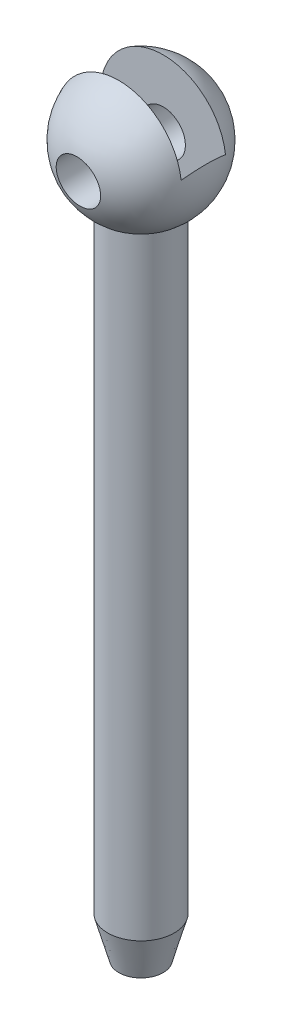
ISO-10303-21;
HEADER;
FILE_DESCRIPTION(('STEP AP214'),'2;1');
FILE_NAME('part.step','',(''),(''),'','','');
FILE_SCHEMA(('AUTOMOTIVE_DESIGN { 1 0 10303 214 1 1 1 1 }'));
ENDSEC;
DATA;
#1=APPLICATION_CONTEXT('core data for automotive mechanical design processes');
#2=APPLICATION_PROTOCOL_DEFINITION('international standard','automotive_design',2000,#1);
#3=PRODUCT_CONTEXT('',#1,'mechanical');
#4=PRODUCT('Part','Part','',(#3));
#5=PRODUCT_RELATED_PRODUCT_CATEGORY('part','',(#4));
#6=PRODUCT_DEFINITION_FORMATION('','',#4);
#7=PRODUCT_DEFINITION_CONTEXT('part definition',#1,'design');
#8=PRODUCT_DEFINITION('design','',#6,#7);
#9=PRODUCT_DEFINITION_SHAPE('','',#8);
#10=(LENGTH_UNIT() NAMED_UNIT(*) SI_UNIT(.MILLI.,.METRE.));
#11=(NAMED_UNIT(*) PLANE_ANGLE_UNIT() SI_UNIT($,.RADIAN.));
#12=(NAMED_UNIT(*) SI_UNIT($,.STERADIAN.) SOLID_ANGLE_UNIT());
#13=UNCERTAINTY_MEASURE_WITH_UNIT(LENGTH_MEASURE(1.E-05),#10,'distance_accuracy_value','');
#14=(GEOMETRIC_REPRESENTATION_CONTEXT(3) GLOBAL_UNCERTAINTY_ASSIGNED_CONTEXT((#13)) GLOBAL_UNIT_ASSIGNED_CONTEXT((#10,
#11,#12)) REPRESENTATION_CONTEXT('',''));
#15=CARTESIAN_POINT('',(0.,0.,0.));
#16=DIRECTION('',(0.,0.,1.));
#17=DIRECTION('',(1.,0.,0.));
#18=AXIS2_PLACEMENT_3D('',#15,#16,#17);
#19=CARTESIAN_POINT('',(0.,71.,0.));
#20=DIRECTION('',(0.,1.,0.));
#21=DIRECTION('',(1.,0.,0.));
#22=AXIS2_PLACEMENT_3D('',#19,#20,#21);
#23=SPHERICAL_SURFACE('',#22,15.);
#24=CARTESIAN_POINT('',(0.,58.0096189432334,0.));
#25=DIRECTION('',(0.,1.,0.));
#26=DIRECTION('',(-1.,0.,0.));
#27=AXIS2_PLACEMENT_3D('',#24,#25,#26);
#28=CIRCLE('',#27,7.5);
#29=CARTESIAN_POINT('',(-7.5,58.0096189432334,0.));
#30=VERTEX_POINT('',#29);
#31=EDGE_CURVE('E115',#30,#30,#28,.T.);
#32=ORIENTED_EDGE('',*,*,#31,.T.);
#33=EDGE_LOOP('',(#32));
#34=FACE_BOUND('',#33,.T.);
#35=CARTESIAN_POINT('',(-2.74954306538082,65.8238758481558,13.8075251836204));
#36=CARTESIAN_POINT('',(-2.86698503750069,65.9011980196577,13.8131251843968));
#37=CARTESIAN_POINT('',(-2.98113777945837,65.9834614382162,13.8190796514565));
#38=CARTESIAN_POINT('',(-3.20212162950242,66.1573208475025,13.8316550430235));
#39=CARTESIAN_POINT('',(-3.30895075658177,66.2489193467995,13.8382761466669));
#40=CARTESIAN_POINT('',(-3.51458298248944,66.4408558049773,13.8521391735683));
#41=CARTESIAN_POINT('',(-3.613378647329,66.541201684539,13.8593816593872));
#42=CARTESIAN_POINT('',(-3.8021743128068,66.7498807949035,13.8744303743011));
#43=CARTESIAN_POINT('',(-3.89217107115925,66.8582169444146,13.8822368093754));
#44=CARTESIAN_POINT('',(-4.0626109756859,67.081961061112,13.8983447544111));
#45=CARTESIAN_POINT('',(-4.14306316335241,67.1973621760066,13.9066457844632));
#46=CARTESIAN_POINT('',(-4.29397673855987,67.4345508559795,13.9236911184587));
#47=CARTESIAN_POINT('',(-4.36443443345277,67.5563407588652,13.9324355846262));
#48=CARTESIAN_POINT('',(-4.4947893292668,67.8053239439032,13.9502948918091));
#49=CARTESIAN_POINT('',(-4.55469304313316,67.9325138331097,13.9594095001029));
#50=CARTESIAN_POINT('',(-4.66359493718918,68.1915131645917,13.9779509334269));
#51=CARTESIAN_POINT('',(-4.71258907857345,68.3233242968534,13.9873778726057));
#52=CARTESIAN_POINT('',(-4.79936582855631,68.590786222276,14.0064864922278));
#53=CARTESIAN_POINT('',(-4.83713168570084,68.7264424249249,14.0161685300591));
#54=CARTESIAN_POINT('',(-4.90110148092889,69.0004947085697,14.0357074951939));
#55=CARTESIAN_POINT('',(-4.92730114271756,69.1388917832039,14.0455644857827));
#56=CARTESIAN_POINT('',(-4.9679282283205,69.4173507244756,14.0653759116983));
#57=CARTESIAN_POINT('',(-4.98235942033918,69.5574120436453,14.0753303148002));
#58=CARTESIAN_POINT('',(-4.99936582428968,69.8383023089262,14.0952724017278));
#59=CARTESIAN_POINT('',(-5.00193665427761,69.9791315195075,14.1052600964899));
#60=CARTESIAN_POINT('',(-4.99518810186334,70.2606530268487,14.1252046213555));
#61=CARTESIAN_POINT('',(-4.98585651958279,70.4013450349657,14.1351614092874));
#62=CARTESIAN_POINT('',(-4.95534335640556,70.6814961495864,14.1549669880959));
#63=CARTESIAN_POINT('',(-4.93415739580886,70.8209547810535,14.1648157376849));
#64=CARTESIAN_POINT('',(-4.88008341615704,71.0975543524698,14.1843295161819));
#65=CARTESIAN_POINT('',(-4.84719971431836,71.2346961279537,14.1939946114857));
#66=CARTESIAN_POINT('',(-4.76997120807767,71.5057460763475,14.2130779025835));
#67=CARTESIAN_POINT('',(-4.72562217910271,71.6396530374128,14.2224960059577));
#68=CARTESIAN_POINT('',(-4.57583616686334,72.0349213080117,14.2502696022602));
#69=CARTESIAN_POINT('',(-4.45359167648511,72.2901792188908,14.2681690097377));
#70=CARTESIAN_POINT('',(-4.16787137773871,72.7764147852286,14.3022068388133));
#71=CARTESIAN_POINT('',(-4.0043959386799,73.0073926581395,14.3183452761829));
#72=CARTESIAN_POINT('',(-3.64107499742301,73.438286091182,14.348407504649));
#73=CARTESIAN_POINT('',(-3.4412891630959,73.6382516284025,14.3623348598307));
#74=CARTESIAN_POINT('',(-3.01083503012171,74.0017806617745,14.38762391006));
#75=CARTESIAN_POINT('',(-2.78016708106496,74.1653445699424,14.3989856341471));
#76=CARTESIAN_POINT('',(-2.29507250919428,74.4510319051483,14.4188127879952));
#77=CARTESIAN_POINT('',(-2.04070285664552,74.573251590576,14.4272849456834));
#78=CARTESIAN_POINT('',(-1.51497715225919,74.7732525513102,14.4411410017075));
#79=CARTESIAN_POINT('',(-1.24362131757245,74.8510343945801,14.4465249395142));
#80=CARTESIAN_POINT('',(-0.692225648207235,74.9598012913516,14.454051918797));
#81=CARTESIAN_POINT('',(-0.412204825694107,74.9908822814934,14.4562016043457));
#82=CARTESIAN_POINT('',(0.149089138921062,75.005655625972,14.4572235082513));
#83=CARTESIAN_POINT('',(0.430362272154002,74.9893483153904,14.456095749783));
#84=CARTESIAN_POINT('',(0.985904634683509,74.9098530722801,14.4505956131336));
#85=CARTESIAN_POINT('',(1.26018007823028,74.8467083468534,14.4462262253263));
#86=CARTESIAN_POINT('',(1.79422076279933,74.6754046278134,14.4343633117377));
#87=CARTESIAN_POINT('',(2.05398599263829,74.567245599507,14.4268697835485));
#88=CARTESIAN_POINT('',(2.55180763185183,74.3089396799824,14.4089541359715));
#89=CARTESIAN_POINT('',(2.78985124537801,74.1587682490154,14.3985303049553));
#90=CARTESIAN_POINT('',(3.23734782064043,73.8207600214164,14.3750359180262));
#91=CARTESIAN_POINT('',(3.44680053902575,73.6329229042272,14.3619653395879));
#92=CARTESIAN_POINT('',(3.83159354184812,73.2245532985098,14.3335030275594));
#93=CARTESIAN_POINT('',(4.00686989673983,73.0039608703933,14.3181070377462));
#94=CARTESIAN_POINT('',(4.31791423230488,72.5366139377717,14.2854294452894));
#95=CARTESIAN_POINT('',(4.45368171544596,72.2898591038588,14.268147818904));
#96=CARTESIAN_POINT('',(4.68219103843725,71.7765680086684,14.2321277666079));
#97=CARTESIAN_POINT('',(4.77483042303671,71.5099863699508,14.2133859939087));
#98=CARTESIAN_POINT('',(4.91402318489522,70.9651127723218,14.1749988962438));
#99=CARTESIAN_POINT('',(4.96057600113289,70.6868206708995,14.1553535602819));
#100=CARTESIAN_POINT('',(5.0063460980926,70.1258687936771,14.1156697296394));
#101=CARTESIAN_POINT('',(5.00547408225485,69.8432017803753,14.0956305643061));
#102=CARTESIAN_POINT('',(4.95619035384181,69.2820172970808,14.0557615222629));
#103=CARTESIAN_POINT('',(4.90777842322948,69.0034998461257,14.0359316465134));
#104=CARTESIAN_POINT('',(4.76476284443605,68.4584013561053,13.9970418812716));
#105=CARTESIAN_POINT('',(4.67013307143589,68.1918271611629,13.9779824338723));
#106=CARTESIAN_POINT('',(4.43719898794041,67.6782209310517,13.9411900552568));
#107=CARTESIAN_POINT('',(4.29889474407558,67.4311888660698,13.9234571220169));
#108=CARTESIAN_POINT('',(4.06195270473721,67.0810129980151,13.8982767672068));
#109=CARTESIAN_POINT('',(3.97805675636475,66.9676820453635,13.8901197483898));
#110=CARTESIAN_POINT('',(3.80098908579616,66.7484938155024,13.8743306053604));
#111=CARTESIAN_POINT('',(3.70782082801844,66.6426337720116,13.8666982868927));
#112=CARTESIAN_POINT('',(3.51282526403587,66.4391099430689,13.8520133526492));
#113=CARTESIAN_POINT('',(3.41099480321093,66.341449169595,13.8449609499231));
#114=CARTESIAN_POINT('',(3.19946110676483,66.1550934494574,13.8314942146842));
#115=CARTESIAN_POINT('',(3.08976082226953,66.0663951716655,13.8250796451195));
#116=CARTESIAN_POINT('',(2.86344799806327,65.8987243185065,13.8129462967008));
#117=CARTESIAN_POINT('',(2.74684881423619,65.8197338067851,13.8072262348971));
#118=CARTESIAN_POINT('',(2.50742450797753,65.671881395939,13.7965137438297));
#119=CARTESIAN_POINT('',(2.38460172510549,65.6030157281375,13.7915210438332));
#120=CARTESIAN_POINT('',(2.13352358966233,65.4758552153953,13.7822977663016));
#121=CARTESIAN_POINT('',(2.00526650536333,65.4175637718332,13.778067433998));
#122=CARTESIAN_POINT('',(1.7443200486295,65.3120208827295,13.7704050939039));
#123=CARTESIAN_POINT('',(1.61163234520414,65.264765332426,13.7669727892919));
#124=CARTESIAN_POINT('',(1.3430241728436,65.1817010303938,13.7609378733662));
#125=CARTESIAN_POINT('',(1.20711149150319,65.1458672263922,13.7583334462341));
#126=CARTESIAN_POINT('',(0.932790522362637,65.0857747041163,13.7539650350685));
#127=CARTESIAN_POINT('',(0.79438318188059,65.0615116842271,13.7522007387041));
#128=CARTESIAN_POINT('',(0.515924457413835,65.0247052892124,13.7495240782785));
#129=CARTESIAN_POINT('',(0.375872119896574,65.0121690893633,13.7486122358076));
#130=CARTESIAN_POINT('',(0.0952582600984139,64.9989352675893,13.7476496452209));
#131=CARTESIAN_POINT('',(-0.0453030547311414,64.9982332694268,13.7475985787938));
#132=CARTESIAN_POINT('',(-0.325887216383327,65.0086582155902,13.7483568681455));
#133=CARTESIAN_POINT('',(-0.465910367181152,65.0197770204599,13.7491656318705));
#134=CARTESIAN_POINT('',(-0.744466402440896,65.05374384151,13.7516358737234));
#135=CARTESIAN_POINT('',(-0.882999814220094,65.0765875579241,13.7532970392579));
#136=CARTESIAN_POINT('',(-1.15752230897894,65.1338123744651,13.7574572166611));
#137=CARTESIAN_POINT('',(-1.29351356531414,65.1681830942778,13.7599554747082));
#138=CARTESIAN_POINT('',(-1.56206989735419,65.2482036473197,13.765769710435));
#139=CARTESIAN_POINT('',(-1.69463586974496,65.2938504949026,13.7690854716592));
#140=CARTESIAN_POINT('',(-1.98692186839556,65.4084471692407,13.7774059833517));
#141=CARTESIAN_POINT('',(-2.14548257317774,65.4803619364145,13.7826252070573));
#142=CARTESIAN_POINT('',(-2.45421800023223,65.6402937952867,13.7942241965626));
#143=CARTESIAN_POINT('',(-2.60439272976924,65.7283108730355,13.8006039613567));
#144=CARTESIAN_POINT('',(-2.74954306538082,65.8238758481558,13.8075251836204));
#145=B_SPLINE_CURVE_WITH_KNOTS('',3,(#35,#36,#37,#38,#39,#40,#41,#42,#43,#44,#45,#46,#47,#48,
#49,#50,#51,#52,#53,#54,#55,#56,#57,#58,#59,#60,#61,#62,#63,#64,#65,#66,#67,#68,#69,#70,#71,#72,
#73,#74,#75,#76,#77,#78,#79,#80,#81,#82,#83,#84,#85,#86,#87,#88,#89,#90,#91,#92,#93,#94,#95,#96,
#97,#98,#99,#100,#101,#102,#103,#104,#105,#106,#107,#108,#109,#110,#111,#112,#113,#114,#115,
#116,#117,#118,#119,#120,#121,#122,#123,#124,#125,#126,#127,#128,#129,#130,#131,#132,#133,#134,
#135,#136,#137,#138,#139,#140,#141,#142,#143,#144),.UNSPECIFIED.,.T.,.F.,(4,2,2,2,2,2,2,2,2,2,2,
2,2,2,2,2,2,2,2,2,2,2,2,2,2,2,2,2,2,2,2,2,2,2,2,2,2,2,2,2,2,2,2,2,2,2,2,2,2,2,2,2,2,2,4),(0.,
0.42201352611639,0.844140758340934,1.26665427461215,1.68932289957396,2.11158788176626,
2.53400847336999,2.95616746578557,3.37848248573832,3.80142443097263,4.22452261711307,
4.64748527610624,5.07060419089392,5.49415714793938,5.91786669362046,6.34142002527727,
6.76512964454268,7.61149218139801,8.45784713757607,9.30282367433955,10.1477906466461,
10.9907765888998,11.8337517566468,12.6749928381785,13.5162279713296,14.3566880361117,
15.1971487486449,16.0381014090406,16.8790612267443,17.7215793436287,18.5641080698216,
19.4086282231706,20.2531586569127,21.0992793180801,21.945403859913,22.7920072315037,
23.6386093115085,24.0619188459021,24.485070808483,24.9083775406937,25.3315263574831,
25.7538812074723,26.176078448043,26.5984112556284,27.0205867269254,27.4418297295559,
27.8629160063723,28.2842597645754,28.7054477082235,29.1263458220008,29.5470896939412,
29.967455689827,30.3877105020255,30.9092911337938,31.4308713137136),.UNSPECIFIED.);
#146=CARTESIAN_POINT('',(-2.74954306538082,65.8238758481558,13.8075251836204));
#147=VERTEX_POINT('',#146);
#148=EDGE_CURVE('E114',#147,#147,#145,.T.);
#149=ORIENTED_EDGE('',*,*,#148,.T.);
#150=EDGE_LOOP('',(#149));
#151=FACE_BOUND('',#150,.T.);
#152=CARTESIAN_POINT('',(-2.74954306538082,65.8238758481558,-13.8075251836204));
#153=CARTESIAN_POINT('',(-2.63250235693748,65.746815445855,-13.8019441397373));
#154=CARTESIAN_POINT('',(-2.51222225136319,65.6746808940401,-13.7967164698053));
#155=CARTESIAN_POINT('',(-2.26596587922747,65.5407349844808,-13.7870045176841));
#156=CARTESIAN_POINT('',(-2.13998815638614,65.4789262851335,-13.7825204269319));
#157=CARTESIAN_POINT('',(-1.88315380259751,65.3660571230731,-13.7743286968859));
#158=CARTESIAN_POINT('',(-1.75229303146456,65.3150060368821,-13.7706217349654));
#159=CARTESIAN_POINT('',(-1.4866737756643,65.2240693769893,-13.7640164805204));
#160=CARTESIAN_POINT('',(-1.351913886924,65.1841878820873,-13.7611184834069));
#161=CARTESIAN_POINT('',(-1.07960751436171,65.1159304853058,-13.7561574259117));
#162=CARTESIAN_POINT('',(-0.942063275720545,65.0875456728605,-13.7540937189112));
#163=CARTESIAN_POINT('',(-0.665013855108979,65.0424339067884,-13.7508134490989));
#164=CARTESIAN_POINT('',(-0.525507968664579,65.0257112563525,-13.7495971989882));
#165=CARTESIAN_POINT('',(-0.245665144709338,65.0040684834651,-13.7480230430635));
#166=CARTESIAN_POINT('',(-0.105328770089199,64.9991411201875,-13.7476646106572));
#167=CARTESIAN_POINT('',(0.175312788694832,65.0011037708225,-13.7478073723133));
#168=CARTESIAN_POINT('',(0.315617942251823,65.0079981450779,-13.7483088835582));
#169=CARTESIAN_POINT('',(0.594983519499448,65.0335479084457,-13.7501671508351));
#170=CARTESIAN_POINT('',(0.734045196217561,65.0521896719456,-13.751522916031));
#171=CARTESIAN_POINT('',(1.0101514395417,65.1010962518527,-13.7550789042128));
#172=CARTESIAN_POINT('',(1.14719524316999,65.1313653531458,-13.7572794385114));
#173=CARTESIAN_POINT('',(1.41819469329025,65.2032958283694,-13.7625069837352));
#174=CARTESIAN_POINT('',(1.55215135108047,65.2449534124048,-13.765533719714));
#175=CARTESIAN_POINT('',(1.81612280374949,65.339382552551,-13.7723918350923));
#176=CARTESIAN_POINT('',(1.94613612377548,65.3921582097113,-13.7762235114032));
#177=CARTESIAN_POINT('',(2.20125213851534,65.508436831624,-13.7846614556174));
#178=CARTESIAN_POINT('',(2.32635470996917,65.5719400654272,-13.789267742948));
#179=CARTESIAN_POINT('',(2.57080475363286,65.7092395330913,-13.7992211318764));
#180=CARTESIAN_POINT('',(2.69015008617789,65.7830395546688,-13.8045685060811));
#181=CARTESIAN_POINT('',(2.9221593137216,65.9403679574691,-13.8159606369755));
#182=CARTESIAN_POINT('',(3.03482562846643,66.0238927825759,-13.8220051387356));
#183=CARTESIAN_POINT('',(3.25274351689285,66.2000880387068,-13.8347467184036));
#184=CARTESIAN_POINT('',(3.3579923331301,66.2927618404335,-13.8414440368134));
#185=CARTESIAN_POINT('',(3.66177095992967,66.5838628643254,-13.8624644855915));
#186=CARTESIAN_POINT('',(3.84813253624621,66.7952335564405,-13.8777062417796));
#187=CARTESIAN_POINT('',(4.18263296892322,67.2460077302186,-13.9101501932394));
#188=CARTESIAN_POINT('',(4.33077137184013,67.4854115443912,-13.9273524117647));
#189=CARTESIAN_POINT('',(4.58516675702923,67.9862280983045,-13.9632653399157));
#190=CARTESIAN_POINT('',(4.69131680753737,68.2476949997163,-13.9819797566993));
#191=CARTESIAN_POINT('',(4.85819322221043,68.7846698825009,-14.0203319269789));
#192=CARTESIAN_POINT('',(4.91891898119175,69.0601780508921,-14.0399696927728));
#193=CARTESIAN_POINT('',(4.99333687112622,69.618010994151,-14.0796454571769));
#194=CARTESIAN_POINT('',(5.00693528161043,69.900348228876,-14.099684173686));
#195=CARTESIAN_POINT('',(4.98645042305037,70.4633029197681,-14.1395545677805));
#196=CARTESIAN_POINT('',(4.95236690504253,70.7439203669478,-14.1593862442844));
#197=CARTESIAN_POINT('',(4.83743386510845,71.2956386310823,-14.1982976525453));
#198=CARTESIAN_POINT('',(4.75655683847448,71.5667337514264,-14.2173769350022));
#199=CARTESIAN_POINT('',(4.55027981988903,72.0915160233357,-14.2542404971837));
#200=CARTESIAN_POINT('',(4.42487996901364,72.345203230057,-14.2720247810115));
#201=CARTESIAN_POINT('',(4.13323291961454,72.827678352558,-14.3057905016492));
#202=CARTESIAN_POINT('',(3.96702735858708,73.0564913083867,-14.321773752101));
#203=CARTESIAN_POINT('',(3.59839127150857,73.4829613408381,-14.3515206297115));
#204=CARTESIAN_POINT('',(3.39596112851063,73.6806187468704,-14.3652842803382));
#205=CARTESIAN_POINT('',(2.96107931250137,74.0387100574108,-14.3901902456704));
#206=CARTESIAN_POINT('',(2.72869253828435,74.1992223919014,-14.4013380842424));
#207=CARTESIAN_POINT('',(2.24015453124392,74.4789432437451,-14.4207482846225));
#208=CARTESIAN_POINT('',(1.98400360853023,74.5981522999881,-14.4290106840775));
#209=CARTESIAN_POINT('',(1.45584628117949,74.7915991958832,-14.4424112757506));
#210=CARTESIAN_POINT('',(1.1838779432334,74.8659404750055,-14.4475566541424));
#211=CARTESIAN_POINT('',(0.631283545455529,74.9679391647922,-14.4546148675879));
#212=CARTESIAN_POINT('',(0.350657574448953,74.9955970542547,-14.456527735795));
#213=CARTESIAN_POINT('',(-0.210828073393088,75.0034252924309,-14.4570692280336));
#214=CARTESIAN_POINT('',(-0.491686737255062,74.983668166628,-14.4557028679364));
#215=CARTESIAN_POINT('',(-1.04609009433946,74.8973865552235,-14.4497329357057));
#216=CARTESIAN_POINT('',(-1.31963480698021,74.8308621938004,-14.4451293721679));
#217=CARTESIAN_POINT('',(-1.8516183895048,74.6529742220886,-14.432809364238));
#218=CARTESIAN_POINT('',(-2.11005907235292,74.5416160060003,-14.4250932943279));
#219=CARTESIAN_POINT('',(-2.60457064860797,74.2772425706011,-14.4067542776482));
#220=CARTESIAN_POINT('',(-2.84064144975393,74.124227179492,-14.3961313188902));
#221=CARTESIAN_POINT('',(-3.28403723069644,73.7807276801373,-14.3722509685829));
#222=CARTESIAN_POINT('',(-3.49132348905918,73.5901939184442,-14.3589900856493));
#223=CARTESIAN_POINT('',(-3.87104238968178,73.1770484050261,-14.3301885258463));
#224=CARTESIAN_POINT('',(-4.04347457432633,72.9544362321946,-14.3146478190487));
#225=CARTESIAN_POINT('',(-4.27236992065381,72.601288359394,-14.2899490972991));
#226=CARTESIAN_POINT('',(-4.34380264536944,72.4801517526082,-14.2814697790572));
#227=CARTESIAN_POINT('',(-4.47620312561567,72.2323314807706,-14.26410663719));
#228=CARTESIAN_POINT('',(-4.53717469429904,72.1056498581331,-14.2552229624553));
#229=CARTESIAN_POINT('',(-4.64824532228794,71.8475841508505,-14.2371082185096));
#230=CARTESIAN_POINT('',(-4.69834025124143,71.7161983017839,-14.2278770188837));
#231=CARTESIAN_POINT('',(-4.78727152309648,71.4497406224008,-14.2091368134247));
#232=CARTESIAN_POINT('',(-4.82611198136143,71.3146701592359,-14.1996279105415));
#233=CARTESIAN_POINT('',(-4.89237273257752,71.0413975403729,-14.1803698131909));
#234=CARTESIAN_POINT('',(-4.91976286932344,70.9031881133346,-14.1706200549445));
#235=CARTESIAN_POINT('',(-4.96277741270982,70.6250126512333,-14.150975999312));
#236=CARTESIAN_POINT('',(-4.97840612676089,70.4850472783656,-14.1410817561955));
#237=CARTESIAN_POINT('',(-4.99780868030598,70.2042553587521,-14.1212113310343));
#238=CARTESIAN_POINT('',(-5.00157852296847,70.0634285376889,-14.1112351225001));
#239=CARTESIAN_POINT('',(-4.99722696398637,69.7820113228851,-14.0912782308247));
#240=CARTESIAN_POINT('',(-4.98910994091379,69.641420861176,-14.0812975506844));
#241=CARTESIAN_POINT('',(-4.96102823880959,69.3612074679155,-14.0613837948554));
#242=CARTESIAN_POINT('',(-4.94104556192804,69.2215863327937,-14.0514508146386));
#243=CARTESIAN_POINT('',(-4.88936776934131,68.9445724147927,-14.0317227060403));
#244=CARTESIAN_POINT('',(-4.85767697327041,68.8071788295642,-14.0219275281993));
#245=CARTESIAN_POINT('',(-4.78278107310086,68.5354599485334,-14.0025359836021));
#246=CARTESIAN_POINT('',(-4.73956884230032,68.4011366078883,-13.9929397438743));
#247=CARTESIAN_POINT('',(-4.64196091244377,68.136653192903,-13.9740257548239));
#248=CARTESIAN_POINT('',(-4.58756935997915,68.0064915955314,-13.964707903706));
#249=CARTESIAN_POINT('',(-4.46794308568888,67.7511394492986,-13.9464103859533));
#250=CARTESIAN_POINT('',(-4.4027025522519,67.6259516095642,-13.9374309037562));
#251=CARTESIAN_POINT('',(-4.2618854447626,67.3815625522787,-13.9198851308075));
#252=CARTESIAN_POINT('',(-4.18631268012243,67.2623591503558,-13.9113186893383));
#253=CARTESIAN_POINT('',(-4.02541604032986,67.0308456508421,-13.8946666232671));
#254=CARTESIAN_POINT('',(-3.94010094620165,66.9185294837933,-13.886580575514));
#255=CARTESIAN_POINT('',(-3.76030054005761,66.7015162100084,-13.8709442200585));
#256=CARTESIAN_POINT('',(-3.66581765219633,66.5968171019072,-13.8633937716418));
#257=CARTESIAN_POINT('',(-3.44324608976387,66.3702258027591,-13.8470406349355));
#258=CARTESIAN_POINT('',(-3.31271240246313,66.2507093142538,-13.8384061395985));
#259=CARTESIAN_POINT('',(-3.03968524453323,66.0261408015062,-13.8221687019656));
#260=CARTESIAN_POINT('',(-2.89719177946036,65.921088770544,-13.8145657591904));
#261=CARTESIAN_POINT('',(-2.74954306538082,65.8238758481558,-13.8075251836204));
#262=B_SPLINE_CURVE_WITH_KNOTS('',3,(#152,#153,#154,#155,#156,#157,#158,#159,#160,#161,#162,
#163,#164,#165,#166,#167,#168,#169,#170,#171,#172,#173,#174,#175,#176,#177,#178,#179,#180,#181,
#182,#183,#184,#185,#186,#187,#188,#189,#190,#191,#192,#193,#194,#195,#196,#197,#198,#199,#200,
#201,#202,#203,#204,#205,#206,#207,#208,#209,#210,#211,#212,#213,#214,#215,#216,#217,#218,#219,
#220,#221,#222,#223,#224,#225,#226,#227,#228,#229,#230,#231,#232,#233,#234,#235,#236,#237,#238,
#239,#240,#241,#242,#243,#244,#245,#246,#247,#248,#249,#250,#251,#252,#253,#254,#255,#256,#257,
#258,#259,#260,#261),.UNSPECIFIED.,.T.,.F.,(4,2,2,2,2,2,2,2,2,2,2,2,2,2,2,2,2,2,2,2,2,2,2,2,2,2,
2,2,2,2,2,2,2,2,2,2,2,2,2,2,2,2,2,2,2,2,2,2,2,2,2,2,2,2,4),(0.,0.420573753053456,
0.841255616768806,1.2623026511228,1.68350323935139,2.10437674620676,2.52540546803485,
2.94617566470885,3.36710109211784,3.7875391910955,4.20813237804713,4.62858576869992,
5.04919452159656,5.46981382505314,5.89058826503709,6.31120931880104,6.73198592191884,
7.57425745412923,8.41653897779264,9.2609519390134,10.1053761500692,10.9514786766969,
11.7975856211301,12.6441904038661,13.490792504054,14.3365343093123,15.1822671718891,
16.0261976778947,16.8701171725972,17.7120835641689,18.5540413202407,19.3947120480592,
20.2353805436993,21.0759479242377,21.9165187714103,22.7582096354519,23.5999115497254,
24.0221573830157,24.4442489767234,24.866500578438,25.2885975822063,25.7117993455221,
26.1348460432367,26.5580353064006,26.9810687254018,27.4047454474005,27.8282660124792,
28.2520491607828,28.6756754038095,29.0995293114484,29.5232273668105,29.9465465019289,
30.3697540061624,30.900314727205,31.43087520176),.UNSPECIFIED.);
#263=CARTESIAN_POINT('',(-2.74954306538082,65.8238758481558,-13.8075251836204));
#264=VERTEX_POINT('',#263);
#265=EDGE_CURVE('E119',#264,#264,#262,.T.);
#266=ORIENTED_EDGE('',*,*,#265,.T.);
#267=EDGE_LOOP('',(#266));
#268=FACE_BOUND('',#267,.T.);
#269=CARTESIAN_POINT('',(0.,71.,-5.));
#270=DIRECTION('',(0.,0.,1.));
#271=DIRECTION('',(1.,0.,0.));
#272=AXIS2_PLACEMENT_3D('',#269,#270,#271);
#273=CIRCLE('',#272,14.142135623731);
#274=CARTESIAN_POINT('',(14.0423759899186,72.6768054621084,-5.));
#275=VERTEX_POINT('',#274);
#276=CARTESIAN_POINT('',(-14.0423759899186,72.6768054621085,-5.));
#277=VERTEX_POINT('',#276);
#278=EDGE_CURVE('E112',#275,#277,#273,.T.);
#279=ORIENTED_EDGE('',*,*,#278,.F.);
#280=CARTESIAN_POINT('',(8.67845545353752,64.9642871828009,0.));
#281=DIRECTION('',(0.820970545353753,-0.570970545353753,0.));
#282=DIRECTION('',(0.570970545353753,0.820970545353753,0.));
#283=AXIS2_PLACEMENT_3D('',#280,#281,#282);
#284=CIRCLE('',#283,10.6421135931385);
#285=CARTESIAN_POINT('',(14.0423759899186,72.6768054621084,5.));
#286=VERTEX_POINT('',#285);
#287=EDGE_CURVE('E47',#275,#286,#284,.T.);
#288=ORIENTED_EDGE('',*,*,#287,.T.);
#289=CARTESIAN_POINT('',(0.,71.,5.));
#290=DIRECTION('',(0.,0.,1.));
#291=DIRECTION('',(1.,0.,0.));
#292=AXIS2_PLACEMENT_3D('',#289,#290,#291);
#293=CIRCLE('',#292,14.142135623731);
#294=CARTESIAN_POINT('',(-14.0423759899186,72.6768054621085,5.));
#295=VERTEX_POINT('',#294);
#296=EDGE_CURVE('E108',#286,#295,#293,.T.);
#297=ORIENTED_EDGE('',*,*,#296,.T.);
#298=CARTESIAN_POINT('',(-8.67845545353749,64.9642871828009,0.));
#299=DIRECTION('',(-0.820970545353752,-0.570970545353753,0.));
#300=DIRECTION('',(0.570970545353753,-0.820970545353752,0.));
#301=AXIS2_PLACEMENT_3D('',#298,#299,#300);
#302=CIRCLE('',#301,10.6421135931386);
#303=EDGE_CURVE('E11',#295,#277,#302,.T.);
#304=ORIENTED_EDGE('',*,*,#303,.T.);
#305=EDGE_LOOP('',(#279,#288,#297,#304));
#306=FACE_BOUND('',#305,.T.);
#307=ADVANCED_FACE('F39',(#34,#151,#268,#306),#23,.T.);
#308=CARTESIAN_POINT('',(0.,70.,-20.));
#309=DIRECTION('',(0.,0.,1.));
#310=DIRECTION('',(1.,0.,0.));
#311=AXIS2_PLACEMENT_3D('',#308,#309,#310);
#312=CYLINDRICAL_SURFACE('',#311,5.);
#313=ORIENTED_EDGE('',*,*,#265,.F.);
#314=EDGE_LOOP('',(#313));
#315=FACE_BOUND('',#314,.T.);
#316=CARTESIAN_POINT('',(0.,70.,-5.));
#317=DIRECTION('',(0.,0.,1.));
#318=DIRECTION('',(1.,0.,0.));
#319=AXIS2_PLACEMENT_3D('',#316,#317,#318);
#320=CIRCLE('',#319,5.);
#321=CARTESIAN_POINT('',(4.99999999999999,70.,-5.));
#322=VERTEX_POINT('',#321);
#323=EDGE_CURVE('E111',#322,#322,#320,.F.);
#324=ORIENTED_EDGE('',*,*,#323,.F.);
#325=EDGE_LOOP('',(#324));
#326=FACE_BOUND('',#325,.T.);
#327=ADVANCED_FACE('F146',(#315,#326),#312,.F.);
#328=CARTESIAN_POINT('',(0.,-89.,0.));
#329=DIRECTION('',(0.,1.,0.));
#330=DIRECTION('',(-1.,0.,0.));
#331=AXIS2_PLACEMENT_3D('',#328,#329,#330);
#332=PLANE('',#331);
#333=CARTESIAN_POINT('',(0.,-89.,0.));
#334=DIRECTION('',(0.,1.,0.));
#335=DIRECTION('',(-1.,0.,0.));
#336=AXIS2_PLACEMENT_3D('',#333,#334,#335);
#337=CIRCLE('',#336,4.99999999999998);
#338=CARTESIAN_POINT('',(-4.99999999999996,-89.,0.));
#339=VERTEX_POINT('',#338);
#340=EDGE_CURVE('E122',#339,#339,#337,.T.);
#341=ORIENTED_EDGE('',*,*,#340,.F.);
#342=EDGE_LOOP('',(#341));
#343=FACE_BOUND('',#342,.T.);
#344=ADVANCED_FACE('F41',(#343),#332,.F.);
#345=CARTESIAN_POINT('',(0.,-89.,0.));
#346=DIRECTION('',(0.,1.,0.));
#347=DIRECTION('',(-1.,0.,0.));
#348=AXIS2_PLACEMENT_3D('',#345,#346,#347);
#349=CONICAL_SURFACE('',#348,4.99999999999998,0.270946850338422);
#350=CARTESIAN_POINT('',(0.,-80.,0.));
#351=DIRECTION('',(0.,1.,0.));
#352=DIRECTION('',(-1.,0.,0.));
#353=AXIS2_PLACEMENT_3D('',#350,#351,#352);
#354=CIRCLE('',#353,7.49999999999999);
#355=CARTESIAN_POINT('',(-7.49999999999998,-80.,0.));
#356=VERTEX_POINT('',#355);
#357=EDGE_CURVE('E118',#356,#356,#354,.T.);
#358=ORIENTED_EDGE('',*,*,#357,.F.);
#359=EDGE_LOOP('',(#358));
#360=FACE_BOUND('',#359,.T.);
#361=ORIENTED_EDGE('',*,*,#340,.T.);
#362=EDGE_LOOP('',(#361));
#363=FACE_BOUND('',#362,.T.);
#364=ADVANCED_FACE('F186',(#360,#363),#349,.T.);
#365=CARTESIAN_POINT('',(0.,111.,0.));
#366=DIRECTION('',(0.,1.,0.));
#367=DIRECTION('',(-1.,0.,0.));
#368=AXIS2_PLACEMENT_3D('',#365,#366,#367);
#369=CYLINDRICAL_SURFACE('',#368,7.49999999999999);
#370=ORIENTED_EDGE('',*,*,#31,.F.);
#371=EDGE_LOOP('',(#370));
#372=FACE_BOUND('',#371,.T.);
#373=ORIENTED_EDGE('',*,*,#357,.T.);
#374=EDGE_LOOP('',(#373));
#375=FACE_BOUND('',#374,.T.);
#376=ADVANCED_FACE('F144',(#372,#375),#369,.T.);
#377=CARTESIAN_POINT('',(0.,70.,5.));
#378=DIRECTION('',(0.,0.,1.));
#379=DIRECTION('',(1.,0.,0.));
#380=AXIS2_PLACEMENT_3D('',#377,#378,#379);
#381=CIRCLE('',#380,5.);
#382=CARTESIAN_POINT('',(4.99999999999999,70.,5.));
#383=VERTEX_POINT('',#382);
#384=EDGE_CURVE('E106',#383,#383,#381,.F.);
#385=ORIENTED_EDGE('',*,*,#384,.T.);
#386=EDGE_LOOP('',(#385));
#387=FACE_BOUND('',#386,.T.);
#388=ORIENTED_EDGE('',*,*,#148,.F.);
#389=EDGE_LOOP('',(#388));
#390=FACE_BOUND('',#389,.T.);
#391=ADVANCED_FACE('F139',(#387,#390),#312,.F.);
#392=CARTESIAN_POINT('',(-8.20970545353749,64.2902945464625,-5.));
#393=DIRECTION('',(-0.820970545353752,-0.570970545353753,0.));
#394=DIRECTION('',(0.570970545353753,-0.820970545353752,0.));
#395=AXIS2_PLACEMENT_3D('',#392,#393,#394);
#396=PLANE('',#395);
#397=DIRECTION('',(0.570970545353753,-0.820970545353752,0.));
#398=VECTOR('',#397,1.);
#399=CARTESIAN_POINT('',(-8.20970545353749,64.2902945464625,5.));
#400=LINE('',#399,#398);
#401=CARTESIAN_POINT('',(-8.20970545353749,64.2902945464625,5.));
#402=VERTEX_POINT('',#401);
#403=EDGE_CURVE('E54',#295,#402,#400,.T.);
#404=ORIENTED_EDGE('',*,*,#403,.T.);
#405=DIRECTION('',(0.,0.,1.));
#406=VECTOR('',#405,1.);
#407=CARTESIAN_POINT('',(-8.20970545353749,64.2902945464625,-5.));
#408=LINE('',#407,#406);
#409=CARTESIAN_POINT('',(-8.20970545353749,64.2902945464625,-5.));
#410=VERTEX_POINT('',#409);
#411=EDGE_CURVE('E88',#410,#402,#408,.T.);
#412=ORIENTED_EDGE('',*,*,#411,.F.);
#413=DIRECTION('',(0.570970545353753,-0.820970545353752,0.));
#414=VECTOR('',#413,1.);
#415=CARTESIAN_POINT('',(-8.20970545353749,64.2902945464625,-5.));
#416=LINE('',#415,#414);
#417=EDGE_CURVE('E89',#277,#410,#416,.T.);
#418=ORIENTED_EDGE('',*,*,#417,.F.);
#419=ORIENTED_EDGE('',*,*,#303,.F.);
#420=EDGE_LOOP('',(#404,#412,#418,#419));
#421=FACE_BOUND('',#420,.T.);
#422=ADVANCED_FACE('F143',(#421),#396,.F.);
#423=CARTESIAN_POINT('',(8.20970545353753,64.2902945464625,-5.));
#424=DIRECTION('',(0.820970545353753,-0.570970545353753,0.));
#425=DIRECTION('',(0.570970545353753,0.820970545353753,0.));
#426=AXIS2_PLACEMENT_3D('',#423,#424,#425);
#427=PLANE('',#426);
#428=DIRECTION('',(0.570970545353753,0.820970545353753,0.));
#429=VECTOR('',#428,1.);
#430=CARTESIAN_POINT('',(8.20970545353753,64.2902945464625,-5.));
#431=LINE('',#430,#429);
#432=CARTESIAN_POINT('',(8.20970545353753,64.2902945464625,-5.));
#433=VERTEX_POINT('',#432);
#434=EDGE_CURVE('E91',#433,#275,#431,.T.);
#435=ORIENTED_EDGE('',*,*,#434,.F.);
#436=DIRECTION('',(0.,0.,1.));
#437=VECTOR('',#436,1.);
#438=CARTESIAN_POINT('',(8.20970545353753,64.2902945464625,-5.));
#439=LINE('',#438,#437);
#440=CARTESIAN_POINT('',(8.20970545353753,64.2902945464625,5.));
#441=VERTEX_POINT('',#440);
#442=EDGE_CURVE('E81',#433,#441,#439,.T.);
#443=ORIENTED_EDGE('',*,*,#442,.T.);
#444=DIRECTION('',(0.570970545353753,0.820970545353753,0.));
#445=VECTOR('',#444,1.);
#446=CARTESIAN_POINT('',(8.20970545353753,64.2902945464625,5.));
#447=LINE('',#446,#445);
#448=EDGE_CURVE('E100',#441,#286,#447,.T.);
#449=ORIENTED_EDGE('',*,*,#448,.T.);
#450=ORIENTED_EDGE('',*,*,#287,.F.);
#451=EDGE_LOOP('',(#435,#443,#449,#450));
#452=FACE_BOUND('',#451,.T.);
#453=ADVANCED_FACE('F92',(#452),#427,.F.);
#454=CARTESIAN_POINT('',(0.,70.,-5.));
#455=DIRECTION('',(0.,0.,1.));
#456=DIRECTION('',(1.,0.,0.));
#457=AXIS2_PLACEMENT_3D('',#454,#455,#456);
#458=PLANE('',#457);
#459=ORIENTED_EDGE('',*,*,#323,.T.);
#460=EDGE_LOOP('',(#459));
#461=FACE_BOUND('',#460,.T.);
#462=ORIENTED_EDGE('',*,*,#278,.T.);
#463=ORIENTED_EDGE('',*,*,#417,.T.);
#464=CARTESIAN_POINT('',(0.,70.,-5.));
#465=DIRECTION('',(0.,0.,1.));
#466=DIRECTION('',(1.,0.,0.));
#467=AXIS2_PLACEMENT_3D('',#464,#465,#466);
#468=CIRCLE('',#467,9.99999999999998);
#469=EDGE_CURVE('E85',#410,#433,#468,.T.);
#470=ORIENTED_EDGE('',*,*,#469,.T.);
#471=ORIENTED_EDGE('',*,*,#434,.T.);
#472=EDGE_LOOP('',(#462,#463,#470,#471));
#473=FACE_BOUND('',#472,.T.);
#474=ADVANCED_FACE('F96',(#461,#473),#458,.T.);
#475=CARTESIAN_POINT('',(0.,70.,5.));
#476=DIRECTION('',(0.,0.,1.));
#477=DIRECTION('',(1.,0.,0.));
#478=AXIS2_PLACEMENT_3D('',#475,#476,#477);
#479=PLANE('',#478);
#480=ORIENTED_EDGE('',*,*,#384,.F.);
#481=EDGE_LOOP('',(#480));
#482=FACE_BOUND('',#481,.T.);
#483=ORIENTED_EDGE('',*,*,#448,.F.);
#484=CARTESIAN_POINT('',(0.,70.,5.));
#485=DIRECTION('',(0.,0.,1.));
#486=DIRECTION('',(1.,0.,0.));
#487=AXIS2_PLACEMENT_3D('',#484,#485,#486);
#488=CIRCLE('',#487,9.99999999999998);
#489=EDGE_CURVE('E86',#402,#441,#488,.T.);
#490=ORIENTED_EDGE('',*,*,#489,.F.);
#491=ORIENTED_EDGE('',*,*,#403,.F.);
#492=ORIENTED_EDGE('',*,*,#296,.F.);
#493=EDGE_LOOP('',(#483,#490,#491,#492));
#494=FACE_BOUND('',#493,.T.);
#495=ADVANCED_FACE('F150',(#482,#494),#479,.F.);
#496=CARTESIAN_POINT('',(0.,70.,-5.));
#497=DIRECTION('',(0.,0.,1.));
#498=DIRECTION('',(1.,0.,0.));
#499=AXIS2_PLACEMENT_3D('',#496,#497,#498);
#500=CYLINDRICAL_SURFACE('',#499,9.99999999999998);
#501=ORIENTED_EDGE('',*,*,#489,.T.);
#502=ORIENTED_EDGE('',*,*,#442,.F.);
#503=ORIENTED_EDGE('',*,*,#469,.F.);
#504=ORIENTED_EDGE('',*,*,#411,.T.);
#505=EDGE_LOOP('',(#501,#502,#503,#504));
#506=FACE_BOUND('',#505,.T.);
#507=ADVANCED_FACE('F82',(#506),#500,.F.);
#508=CLOSED_SHELL('',(#307,#327,#344,#364,#376,#391,#422,#453,#474,#495,#507));
#509=MANIFOLD_SOLID_BREP('B2',#508);
#510=ADVANCED_BREP_SHAPE_REPRESENTATION('',(#18,#509),#14);
#511=SHAPE_DEFINITION_REPRESENTATION(#9,#510);
ENDSEC;
END-ISO-10303-21;
